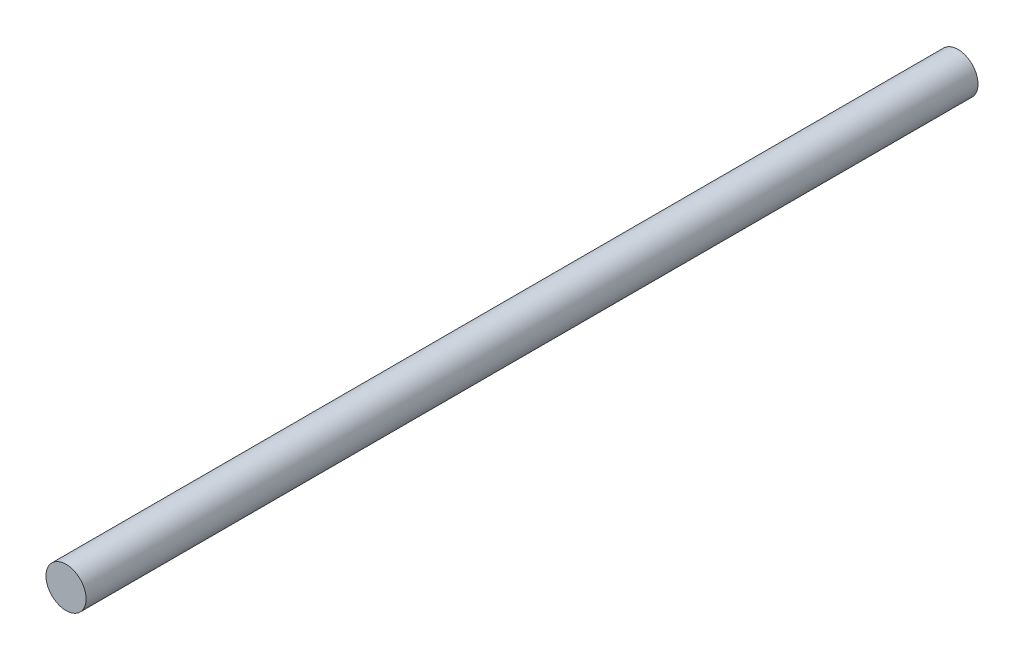
ISO-10303-21;
HEADER;
FILE_DESCRIPTION(('STEP AP214'),'2;1');
FILE_NAME('part.step','',(''),(''),'','','');
FILE_SCHEMA(('AUTOMOTIVE_DESIGN { 1 0 10303 214 1 1 1 1 }'));
ENDSEC;
DATA;
#1=APPLICATION_CONTEXT('core data for automotive mechanical design processes');
#2=APPLICATION_PROTOCOL_DEFINITION('international standard','automotive_design',2000,#1);
#3=PRODUCT_CONTEXT('',#1,'mechanical');
#4=PRODUCT('Part','Part','',(#3));
#5=PRODUCT_RELATED_PRODUCT_CATEGORY('part','',(#4));
#6=PRODUCT_DEFINITION_FORMATION('','',#4);
#7=PRODUCT_DEFINITION_CONTEXT('part definition',#1,'design');
#8=PRODUCT_DEFINITION('design','',#6,#7);
#9=PRODUCT_DEFINITION_SHAPE('','',#8);
#10=(LENGTH_UNIT() NAMED_UNIT(*) SI_UNIT(.MILLI.,.METRE.));
#11=(NAMED_UNIT(*) PLANE_ANGLE_UNIT() SI_UNIT($,.RADIAN.));
#12=(NAMED_UNIT(*) SI_UNIT($,.STERADIAN.) SOLID_ANGLE_UNIT());
#13=UNCERTAINTY_MEASURE_WITH_UNIT(LENGTH_MEASURE(1.E-05),#10,'distance_accuracy_value','');
#14=(GEOMETRIC_REPRESENTATION_CONTEXT(3) GLOBAL_UNCERTAINTY_ASSIGNED_CONTEXT((#13)) GLOBAL_UNIT_ASSIGNED_CONTEXT((#10,
#11,#12)) REPRESENTATION_CONTEXT('',''));
#15=CARTESIAN_POINT('',(0.,0.,0.));
#16=DIRECTION('',(0.,0.,1.));
#17=DIRECTION('',(1.,0.,0.));
#18=AXIS2_PLACEMENT_3D('',#15,#16,#17);
#19=CARTESIAN_POINT('',(0.,0.,186.6));
#20=DIRECTION('',(0.,0.,-1.));
#21=DIRECTION('',(-1.,0.,0.));
#22=AXIS2_PLACEMENT_3D('',#19,#20,#21);
#23=CYLINDRICAL_SURFACE('',#22,4.2);
#24=CARTESIAN_POINT('',(0.,0.,186.6));
#25=DIRECTION('',(0.,0.,1.));
#26=DIRECTION('',(1.,0.,0.));
#27=AXIS2_PLACEMENT_3D('',#24,#25,#26);
#28=CIRCLE('',#27,4.2);
#29=CARTESIAN_POINT('',(4.2,0.,186.6));
#30=VERTEX_POINT('',#29);
#31=EDGE_CURVE('E10',#30,#30,#28,.T.);
#32=ORIENTED_EDGE('',*,*,#31,.F.);
#33=EDGE_LOOP('',(#32));
#34=FACE_BOUND('',#33,.T.);
#35=CARTESIAN_POINT('',(0.,0.,0.));
#36=DIRECTION('',(0.,0.,1.));
#37=DIRECTION('',(1.,0.,0.));
#38=AXIS2_PLACEMENT_3D('',#35,#36,#37);
#39=CIRCLE('',#38,4.2);
#40=CARTESIAN_POINT('',(4.2,0.,0.));
#41=VERTEX_POINT('',#40);
#42=EDGE_CURVE('E35',#41,#41,#39,.T.);
#43=ORIENTED_EDGE('',*,*,#42,.T.);
#44=EDGE_LOOP('',(#43));
#45=FACE_BOUND('',#44,.T.);
#46=ADVANCED_FACE('F32',(#34,#45),#23,.T.);
#47=CARTESIAN_POINT('',(0.,0.,186.6));
#48=DIRECTION('',(0.,0.,1.));
#49=DIRECTION('',(1.,0.,0.));
#50=AXIS2_PLACEMENT_3D('',#47,#48,#49);
#51=PLANE('',#50);
#52=ORIENTED_EDGE('',*,*,#31,.T.);
#53=EDGE_LOOP('',(#52));
#54=FACE_BOUND('',#53,.T.);
#55=ADVANCED_FACE('F47',(#54),#51,.T.);
#56=CARTESIAN_POINT('',(0.,0.,0.));
#57=DIRECTION('',(0.,0.,1.));
#58=DIRECTION('',(1.,0.,0.));
#59=AXIS2_PLACEMENT_3D('',#56,#57,#58);
#60=PLANE('',#59);
#61=ORIENTED_EDGE('',*,*,#42,.F.);
#62=EDGE_LOOP('',(#61));
#63=FACE_BOUND('',#62,.T.);
#64=ADVANCED_FACE('F45',(#63),#60,.F.);
#65=CLOSED_SHELL('',(#46,#55,#64));
#66=MANIFOLD_SOLID_BREP('B2',#65);
#67=ADVANCED_BREP_SHAPE_REPRESENTATION('',(#18,#66),#14);
#68=SHAPE_DEFINITION_REPRESENTATION(#9,#67);
ENDSEC;
END-ISO-10303-21;
